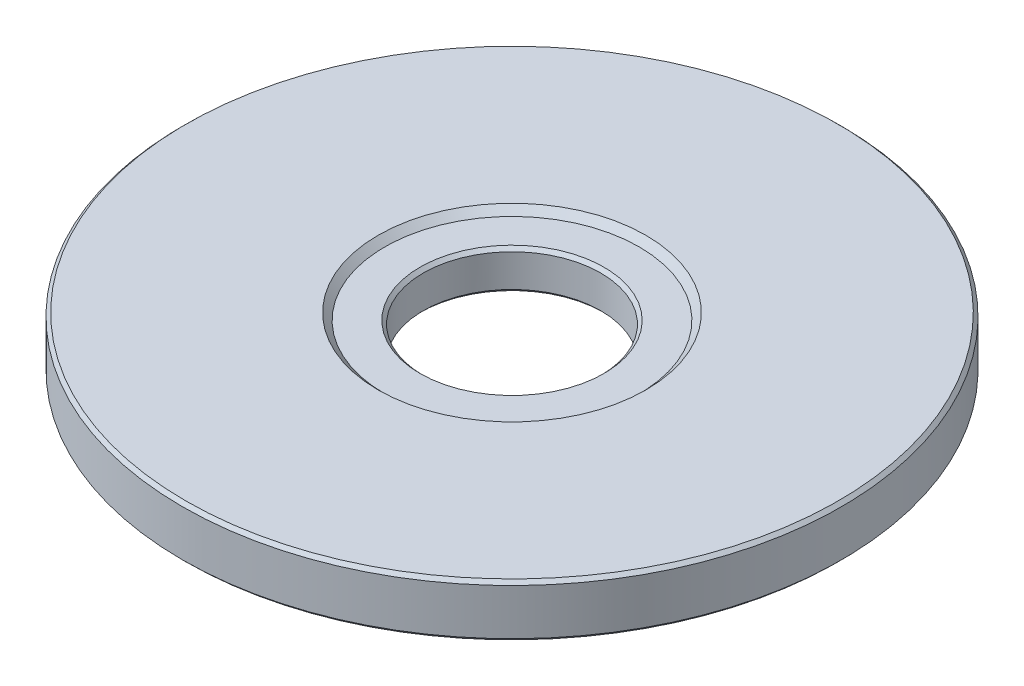
ISO-10303-21;
HEADER;
FILE_DESCRIPTION(('STEP AP214'),'2;1');
FILE_NAME('part.step','',(''),(''),'','','');
FILE_SCHEMA(('AUTOMOTIVE_DESIGN { 1 0 10303 214 1 1 1 1 }'));
ENDSEC;
DATA;
#1=APPLICATION_CONTEXT('core data for automotive mechanical design processes');
#2=APPLICATION_PROTOCOL_DEFINITION('international standard','automotive_design',2000,#1);
#3=PRODUCT_CONTEXT('',#1,'mechanical');
#4=PRODUCT('Part','Part','',(#3));
#5=PRODUCT_RELATED_PRODUCT_CATEGORY('part','',(#4));
#6=PRODUCT_DEFINITION_FORMATION('','',#4);
#7=PRODUCT_DEFINITION_CONTEXT('part definition',#1,'design');
#8=PRODUCT_DEFINITION('design','',#6,#7);
#9=PRODUCT_DEFINITION_SHAPE('','',#8);
#10=(LENGTH_UNIT() NAMED_UNIT(*) SI_UNIT(.MILLI.,.METRE.));
#11=(NAMED_UNIT(*) PLANE_ANGLE_UNIT() SI_UNIT($,.RADIAN.));
#12=(NAMED_UNIT(*) SI_UNIT($,.STERADIAN.) SOLID_ANGLE_UNIT());
#13=UNCERTAINTY_MEASURE_WITH_UNIT(LENGTH_MEASURE(1.E-05),#10,'distance_accuracy_value','');
#14=(GEOMETRIC_REPRESENTATION_CONTEXT(3) GLOBAL_UNCERTAINTY_ASSIGNED_CONTEXT((#13)) GLOBAL_UNIT_ASSIGNED_CONTEXT((#10,
#11,#12)) REPRESENTATION_CONTEXT('',''));
#15=CARTESIAN_POINT('',(0.,0.,0.));
#16=DIRECTION('',(0.,0.,1.));
#17=DIRECTION('',(1.,0.,0.));
#18=AXIS2_PLACEMENT_3D('',#15,#16,#17);
#19=CARTESIAN_POINT('',(-5.17927347777913,41.3814507964171,-24.7015296694144));
#20=DIRECTION('',(0.,-1.,0.));
#21=DIRECTION('',(0.,0.,-1.));
#22=AXIS2_PLACEMENT_3D('',#19,#20,#21);
#23=CYLINDRICAL_SURFACE('',#22,12.5);
#24=CARTESIAN_POINT('',(-5.17927347777913,39.5084507964171,-24.7015296694144));
#25=DIRECTION('',(0.,1.,0.));
#26=DIRECTION('',(0.,0.,1.));
#27=AXIS2_PLACEMENT_3D('',#24,#25,#26);
#28=CIRCLE('',#27,12.5);
#29=CARTESIAN_POINT('',(-5.17927347777913,39.5084507964171,-12.2015296694144));
#30=VERTEX_POINT('',#29);
#31=EDGE_CURVE('E29',#30,#30,#28,.T.);
#32=ORIENTED_EDGE('',*,*,#31,.T.);
#33=EDGE_LOOP('',(#32));
#34=FACE_BOUND('',#33,.T.);
#35=CARTESIAN_POINT('',(-5.17927347777913,41.2544507964171,-24.7015296694144));
#36=DIRECTION('',(0.,1.,0.));
#37=DIRECTION('',(0.,0.,1.));
#38=AXIS2_PLACEMENT_3D('',#35,#36,#37);
#39=CIRCLE('',#38,12.5);
#40=CARTESIAN_POINT('',(-5.17927347777913,41.2544507964171,-12.2015296694144));
#41=VERTEX_POINT('',#40);
#42=EDGE_CURVE('E35',#41,#41,#39,.F.);
#43=ORIENTED_EDGE('',*,*,#42,.T.);
#44=EDGE_LOOP('',(#43));
#45=FACE_BOUND('',#44,.T.);
#46=ADVANCED_FACE('F14',(#34,#45),#23,.T.);
#47=CARTESIAN_POINT('',(-5.17927347777913,41.3814507964171,-24.7015296694144));
#48=DIRECTION('',(0.,1.,0.));
#49=DIRECTION('',(0.,0.,1.));
#50=AXIS2_PLACEMENT_3D('',#47,#48,#49);
#51=PLANE('',#50);
#52=CARTESIAN_POINT('',(-5.17927347777913,41.3814507964171,-24.7015296694144));
#53=DIRECTION('',(0.,1.,0.));
#54=DIRECTION('',(0.,0.,1.));
#55=AXIS2_PLACEMENT_3D('',#52,#53,#54);
#56=CIRCLE('',#55,12.373);
#57=CARTESIAN_POINT('',(-5.17927347777913,41.3814507964171,-12.3285296694144));
#58=VERTEX_POINT('',#57);
#59=EDGE_CURVE('E10',#58,#58,#56,.T.);
#60=ORIENTED_EDGE('',*,*,#59,.T.);
#61=EDGE_LOOP('',(#60));
#62=FACE_BOUND('',#61,.T.);
#63=CARTESIAN_POINT('',(-5.17927347777913,41.3814507964171,-24.7015296694144));
#64=DIRECTION('',(0.,1.,0.));
#65=DIRECTION('',(0.,0.,1.));
#66=AXIS2_PLACEMENT_3D('',#63,#64,#65);
#67=CIRCLE('',#66,5.08);
#68=CARTESIAN_POINT('',(-5.17927347777913,41.3814507964171,-19.6215296694144));
#69=VERTEX_POINT('',#68);
#70=EDGE_CURVE('E69',#69,#69,#67,.T.);
#71=ORIENTED_EDGE('',*,*,#70,.F.);
#72=EDGE_LOOP('',(#71));
#73=FACE_BOUND('',#72,.T.);
#74=ADVANCED_FACE('F78',(#62,#73),#51,.T.);
#75=CARTESIAN_POINT('',(-5.17927347777913,39.3814507964171,-24.7015296694144));
#76=DIRECTION('',(0.,1.,0.));
#77=DIRECTION('',(0.,0.,1.));
#78=AXIS2_PLACEMENT_3D('',#75,#76,#77);
#79=PLANE('',#78);
#80=CARTESIAN_POINT('',(-5.17927347777913,39.3814507964171,-24.7015296694144));
#81=DIRECTION('',(0.,1.,0.));
#82=DIRECTION('',(0.,0.,1.));
#83=AXIS2_PLACEMENT_3D('',#80,#81,#82);
#84=CIRCLE('',#83,12.373);
#85=CARTESIAN_POINT('',(-5.17927347777913,39.3814507964171,-12.3285296694144));
#86=VERTEX_POINT('',#85);
#87=EDGE_CURVE('E22',#86,#86,#84,.F.);
#88=ORIENTED_EDGE('',*,*,#87,.T.);
#89=EDGE_LOOP('',(#88));
#90=FACE_BOUND('',#89,.T.);
#91=CARTESIAN_POINT('',(-5.17927347777913,39.3814507964171,-24.7015296694144));
#92=DIRECTION('',(0.,-1.,0.));
#93=DIRECTION('',(0.,0.,-1.));
#94=AXIS2_PLACEMENT_3D('',#91,#92,#93);
#95=CIRCLE('',#94,5.08);
#96=CARTESIAN_POINT('',(-5.17927347777913,39.3814507964171,-29.7815296694144));
#97=VERTEX_POINT('',#96);
#98=EDGE_CURVE('E65',#97,#97,#95,.T.);
#99=ORIENTED_EDGE('',*,*,#98,.F.);
#100=EDGE_LOOP('',(#99));
#101=FACE_BOUND('',#100,.T.);
#102=ADVANCED_FACE('F80',(#90,#101),#79,.F.);
#103=CARTESIAN_POINT('',(-5.17927347777913,39.6354507964171,-24.7015296694144));
#104=DIRECTION('',(0.,-1.,0.));
#105=DIRECTION('',(0.,0.,-1.));
#106=AXIS2_PLACEMENT_3D('',#103,#104,#105);
#107=PLANE('',#106);
#108=CARTESIAN_POINT('',(-5.17927347777913,39.6354507964171,-24.7015296694144));
#109=DIRECTION('',(0.,-1.,0.));
#110=DIRECTION('',(0.,0.,-1.));
#111=AXIS2_PLACEMENT_3D('',#108,#109,#110);
#112=CIRCLE('',#111,3.49250000000001);
#113=CARTESIAN_POINT('',(-5.17927347777913,39.6354507964171,-28.1940296694144));
#114=VERTEX_POINT('',#113);
#115=EDGE_CURVE('E41',#114,#114,#112,.F.);
#116=ORIENTED_EDGE('',*,*,#115,.T.);
#117=EDGE_LOOP('',(#116));
#118=FACE_BOUND('',#117,.T.);
#119=CARTESIAN_POINT('',(-5.17927347777913,39.6354507964171,-24.7015296694144));
#120=DIRECTION('',(0.,-1.,0.));
#121=DIRECTION('',(0.,0.,-1.));
#122=AXIS2_PLACEMENT_3D('',#119,#120,#121);
#123=CIRCLE('',#122,4.826);
#124=CARTESIAN_POINT('',(-5.17927347777913,39.6354507964171,-29.5275296694144));
#125=VERTEX_POINT('',#124);
#126=EDGE_CURVE('E57',#125,#125,#123,.T.);
#127=ORIENTED_EDGE('',*,*,#126,.T.);
#128=EDGE_LOOP('',(#127));
#129=FACE_BOUND('',#128,.T.);
#130=ADVANCED_FACE('F87',(#118,#129),#107,.T.);
#131=CARTESIAN_POINT('',(-5.17927347777913,41.1274507964171,-24.7015296694144));
#132=DIRECTION('',(0.,1.,0.));
#133=DIRECTION('',(0.,0.,1.));
#134=AXIS2_PLACEMENT_3D('',#131,#132,#133);
#135=PLANE('',#134);
#136=CARTESIAN_POINT('',(-5.17927347777913,41.1274507964171,-24.7015296694144));
#137=DIRECTION('',(0.,1.,0.));
#138=DIRECTION('',(0.,0.,1.));
#139=AXIS2_PLACEMENT_3D('',#136,#137,#138);
#140=CIRCLE('',#139,3.49250000000002);
#141=CARTESIAN_POINT('',(-5.17927347777913,41.1274507964171,-21.2090296694144));
#142=VERTEX_POINT('',#141);
#143=EDGE_CURVE('E45',#142,#142,#140,.F.);
#144=ORIENTED_EDGE('',*,*,#143,.T.);
#145=EDGE_LOOP('',(#144));
#146=FACE_BOUND('',#145,.T.);
#147=CARTESIAN_POINT('',(-5.17927347777913,41.1274507964171,-24.7015296694144));
#148=DIRECTION('',(0.,1.,0.));
#149=DIRECTION('',(0.,0.,1.));
#150=AXIS2_PLACEMENT_3D('',#147,#148,#149);
#151=CIRCLE('',#150,4.826);
#152=CARTESIAN_POINT('',(-5.17927347777913,41.1274507964171,-19.8755296694144));
#153=VERTEX_POINT('',#152);
#154=EDGE_CURVE('E61',#153,#153,#151,.T.);
#155=ORIENTED_EDGE('',*,*,#154,.T.);
#156=EDGE_LOOP('',(#155));
#157=FACE_BOUND('',#156,.T.);
#158=ADVANCED_FACE('F97',(#146,#157),#135,.T.);
#159=CARTESIAN_POINT('',(-5.17927347777913,41.1274507964171,-24.7015296694144));
#160=DIRECTION('',(0.,1.,0.));
#161=DIRECTION('',(0.,0.,1.));
#162=AXIS2_PLACEMENT_3D('',#159,#160,#161);
#163=CONICAL_SURFACE('',#162,4.826,0.785398163397457);
#164=ORIENTED_EDGE('',*,*,#70,.T.);
#165=EDGE_LOOP('',(#164));
#166=FACE_BOUND('',#165,.T.);
#167=ORIENTED_EDGE('',*,*,#154,.F.);
#168=EDGE_LOOP('',(#167));
#169=FACE_BOUND('',#168,.T.);
#170=ADVANCED_FACE('F75',(#166,#169),#163,.F.);
#171=CARTESIAN_POINT('',(-5.17927347777913,39.6354507964171,-24.7015296694144));
#172=DIRECTION('',(0.,-1.,0.));
#173=DIRECTION('',(0.,0.,-1.));
#174=AXIS2_PLACEMENT_3D('',#171,#172,#173);
#175=CONICAL_SURFACE('',#174,4.826,0.785398163397457);
#176=ORIENTED_EDGE('',*,*,#98,.T.);
#177=EDGE_LOOP('',(#176));
#178=FACE_BOUND('',#177,.T.);
#179=ORIENTED_EDGE('',*,*,#126,.F.);
#180=EDGE_LOOP('',(#179));
#181=FACE_BOUND('',#180,.T.);
#182=ADVANCED_FACE('F96',(#178,#181),#175,.F.);
#183=CARTESIAN_POINT('',(-5.17927347777913,41.3814507964171,-24.7015296694144));
#184=DIRECTION('',(0.,-1.,0.));
#185=DIRECTION('',(0.,0.,-1.));
#186=AXIS2_PLACEMENT_3D('',#183,#184,#185);
#187=CYLINDRICAL_SURFACE('',#186,3.3655);
#188=CARTESIAN_POINT('',(-5.17927347777913,41.0004507964171,-24.7015296694144));
#189=DIRECTION('',(0.,1.,0.));
#190=DIRECTION('',(0.,0.,1.));
#191=AXIS2_PLACEMENT_3D('',#188,#189,#190);
#192=CIRCLE('',#191,3.3655);
#193=CARTESIAN_POINT('',(-5.17927347777913,41.0004507964171,-28.0670296694144));
#194=VERTEX_POINT('',#193);
#195=EDGE_CURVE('E49',#194,#194,#192,.T.);
#196=CARTESIAN_POINT('',(-5.17927347777913,39.7624507964171,-24.7015296694144));
#197=DIRECTION('',(0.,-1.,0.));
#198=DIRECTION('',(0.,0.,-1.));
#199=AXIS2_PLACEMENT_3D('',#196,#197,#198);
#200=CIRCLE('',#199,3.3655);
#201=CARTESIAN_POINT('',(-5.17927347777913,39.7624507964171,-28.0670296694144));
#202=VERTEX_POINT('',#201);
#203=EDGE_CURVE('E53',#202,#202,#200,.T.);
#204=CARTESIAN_POINT('',(-5.17927347777913,41.0004507964171,-28.0670296694144));
#205=CARTESIAN_POINT('',(-5.17927347777913,40.9875549630837,-28.0670296694144));
#206=CARTESIAN_POINT('',(-5.17927347777913,40.9746591297504,-28.0670296694144));
#207=CARTESIAN_POINT('',(-5.17927347777913,40.9488674630837,-28.0670296694144));
#208=CARTESIAN_POINT('',(-5.17927347777913,40.9359716297504,-28.0670296694144));
#209=CARTESIAN_POINT('',(-5.17927347777913,40.9101799630837,-28.0670296694144));
#210=CARTESIAN_POINT('',(-5.17927347777913,40.8972841297504,-28.0670296694144));
#211=CARTESIAN_POINT('',(-5.17927347777913,40.8714924630837,-28.0670296694144));
#212=CARTESIAN_POINT('',(-5.17927347777913,40.8585966297504,-28.0670296694144));
#213=CARTESIAN_POINT('',(-5.17927347777913,40.8328049630837,-28.0670296694144));
#214=CARTESIAN_POINT('',(-5.17927347777913,40.8199091297504,-28.0670296694144));
#215=CARTESIAN_POINT('',(-5.17927347777913,40.7941174630837,-28.0670296694144));
#216=CARTESIAN_POINT('',(-5.17927347777913,40.7812216297504,-28.0670296694144));
#217=CARTESIAN_POINT('',(-5.17927347777913,40.7554299630837,-28.0670296694144));
#218=CARTESIAN_POINT('',(-5.17927347777913,40.7425341297504,-28.0670296694144));
#219=CARTESIAN_POINT('',(-5.17927347777913,40.7167424630837,-28.0670296694144));
#220=CARTESIAN_POINT('',(-5.17927347777913,40.7038466297504,-28.0670296694144));
#221=CARTESIAN_POINT('',(-5.17927347777913,40.6780549630837,-28.0670296694144));
#222=CARTESIAN_POINT('',(-5.17927347777913,40.6651591297504,-28.0670296694144));
#223=CARTESIAN_POINT('',(-5.17927347777913,40.6393674630837,-28.0670296694144));
#224=CARTESIAN_POINT('',(-5.17927347777913,40.6264716297504,-28.0670296694144));
#225=CARTESIAN_POINT('',(-5.17927347777913,40.6006799630837,-28.0670296694144));
#226=CARTESIAN_POINT('',(-5.17927347777913,40.5877841297504,-28.0670296694144));
#227=CARTESIAN_POINT('',(-5.17927347777913,40.5619924630837,-28.0670296694144));
#228=CARTESIAN_POINT('',(-5.17927347777913,40.5490966297504,-28.0670296694144));
#229=CARTESIAN_POINT('',(-5.17927347777913,40.5233049630837,-28.0670296694144));
#230=CARTESIAN_POINT('',(-5.17927347777913,40.5104091297504,-28.0670296694144));
#231=CARTESIAN_POINT('',(-5.17927347777913,40.4846174630837,-28.0670296694144));
#232=CARTESIAN_POINT('',(-5.17927347777913,40.4717216297504,-28.0670296694144));
#233=CARTESIAN_POINT('',(-5.17927347777913,40.4459299630837,-28.0670296694144));
#234=CARTESIAN_POINT('',(-5.17927347777913,40.4330341297504,-28.0670296694144));
#235=CARTESIAN_POINT('',(-5.17927347777913,40.4072424630837,-28.0670296694144));
#236=CARTESIAN_POINT('',(-5.17927347777913,40.3943466297504,-28.0670296694144));
#237=CARTESIAN_POINT('',(-5.17927347777913,40.3685549630837,-28.0670296694144));
#238=CARTESIAN_POINT('',(-5.17927347777913,40.3556591297504,-28.0670296694144));
#239=CARTESIAN_POINT('',(-5.17927347777913,40.3298674630838,-28.0670296694144));
#240=CARTESIAN_POINT('',(-5.17927347777913,40.3169716297504,-28.0670296694144));
#241=CARTESIAN_POINT('',(-5.17927347777913,40.2911799630837,-28.0670296694144));
#242=CARTESIAN_POINT('',(-5.17927347777913,40.2782841297504,-28.0670296694144));
#243=CARTESIAN_POINT('',(-5.17927347777913,40.2524924630838,-28.0670296694144));
#244=CARTESIAN_POINT('',(-5.17927347777913,40.2395966297504,-28.0670296694144));
#245=CARTESIAN_POINT('',(-5.17927347777913,40.2138049630838,-28.0670296694144));
#246=CARTESIAN_POINT('',(-5.17927347777913,40.2009091297504,-28.0670296694144));
#247=CARTESIAN_POINT('',(-5.17927347777913,40.1751174630838,-28.0670296694144));
#248=CARTESIAN_POINT('',(-5.17927347777913,40.1622216297504,-28.0670296694144));
#249=CARTESIAN_POINT('',(-5.17927347777913,40.1364299630838,-28.0670296694144));
#250=CARTESIAN_POINT('',(-5.17927347777913,40.1235341297504,-28.0670296694144));
#251=CARTESIAN_POINT('',(-5.17927347777913,40.0977424630838,-28.0670296694144));
#252=CARTESIAN_POINT('',(-5.17927347777913,40.0848466297504,-28.0670296694144));
#253=CARTESIAN_POINT('',(-5.17927347777913,40.0590549630838,-28.0670296694144));
#254=CARTESIAN_POINT('',(-5.17927347777913,40.0461591297504,-28.0670296694144));
#255=CARTESIAN_POINT('',(-5.17927347777913,40.0203674630838,-28.0670296694144));
#256=CARTESIAN_POINT('',(-5.17927347777913,40.0074716297504,-28.0670296694144));
#257=CARTESIAN_POINT('',(-5.17927347777913,39.9816799630838,-28.0670296694144));
#258=CARTESIAN_POINT('',(-5.17927347777913,39.9687841297504,-28.0670296694144));
#259=CARTESIAN_POINT('',(-5.17927347777913,39.9429924630838,-28.0670296694144));
#260=CARTESIAN_POINT('',(-5.17927347777913,39.9300966297504,-28.0670296694144));
#261=CARTESIAN_POINT('',(-5.17927347777913,39.9043049630838,-28.0670296694144));
#262=CARTESIAN_POINT('',(-5.17927347777913,39.8914091297504,-28.0670296694144));
#263=CARTESIAN_POINT('',(-5.17927347777913,39.8656174630838,-28.0670296694144));
#264=CARTESIAN_POINT('',(-5.17927347777913,39.8527216297504,-28.0670296694144));
#265=CARTESIAN_POINT('',(-5.17927347777913,39.8269299630838,-28.0670296694144));
#266=CARTESIAN_POINT('',(-5.17927347777913,39.8140341297504,-28.0670296694144));
#267=CARTESIAN_POINT('',(-5.17927347777913,39.7882424630838,-28.0670296694144));
#268=CARTESIAN_POINT('',(-5.17927347777913,39.7753466297504,-28.0670296694144));
#269=CARTESIAN_POINT('',(-5.17927347777913,39.7624507964171,-28.0670296694144));
#270=B_SPLINE_CURVE_WITH_KNOTS('',3,(#204,#205,#206,#207,#208,#209,#210,#211,#212,#213,#214,
#215,#216,#217,#218,#219,#220,#221,#222,#223,#224,#225,#226,#227,#228,#229,#230,#231,#232,#233,
#234,#235,#236,#237,#238,#239,#240,#241,#242,#243,#244,#245,#246,#247,#248,#249,#250,#251,#252,
#253,#254,#255,#256,#257,#258,#259,#260,#261,#262,#263,#264,#265,#266,#267,#268,#269),
.UNSPECIFIED.,.F.,.F.,(4,2,2,2,2,2,2,2,2,2,2,2,2,2,2,2,2,2,2,2,2,2,2,2,2,2,2,2,2,2,2,2,4),(0.,
0.0386874999999953,0.0773749999999976,0.116062499999993,0.154749999999995,0.19343749999999,
0.232124999999993,0.270812499999988,0.30949999999999,0.348187499999986,0.386874999999988,
0.425562499999983,0.464249999999986,0.502937499999981,0.541624999999983,0.580312499999978,
0.618999999999981,0.657687499999976,0.696374999999978,0.735062499999974,0.773749999999976,
0.812437499999971,0.851124999999973,0.889812499999969,0.928499999999971,0.967187499999966,
1.00587499999997,1.04456249999996,1.08324999999997,1.12193749999996,1.16062499999996,
1.19931249999996,1.23799999999996),.UNSPECIFIED.);
#271=EDGE_CURVE('BSEAM100',#194,#202,#270,.T.);
#272=ORIENTED_EDGE('',*,*,#195,.T.);
#273=ORIENTED_EDGE('',*,*,#203,.T.);
#274=ORIENTED_EDGE('',*,*,#271,.T.);
#275=ORIENTED_EDGE('',*,*,#271,.F.);
#276=EDGE_LOOP('',(#272,#274,#273,#275));
#277=FACE_BOUND('',#276,.T.);
#278=ADVANCED_FACE('F100',(#277),#187,.F.);
#279=CARTESIAN_POINT('',(-5.17927347777913,41.0004507964171,-24.7015296694144));
#280=DIRECTION('',(0.,1.,0.));
#281=DIRECTION('',(0.,0.,1.));
#282=AXIS2_PLACEMENT_3D('',#279,#280,#281);
#283=CONICAL_SURFACE('',#282,3.3655,0.785398163397448);
#284=ORIENTED_EDGE('',*,*,#143,.F.);
#285=EDGE_LOOP('',(#284));
#286=FACE_BOUND('',#285,.T.);
#287=ORIENTED_EDGE('',*,*,#195,.F.);
#288=EDGE_LOOP('',(#287));
#289=FACE_BOUND('',#288,.T.);
#290=ADVANCED_FACE('F102',(#286,#289),#283,.F.);
#291=CARTESIAN_POINT('',(-5.17927347777913,39.7624507964171,-24.7015296694144));
#292=DIRECTION('',(0.,-1.,0.));
#293=DIRECTION('',(0.,0.,-1.));
#294=AXIS2_PLACEMENT_3D('',#291,#292,#293);
#295=CONICAL_SURFACE('',#294,3.3655,0.785398163397438);
#296=ORIENTED_EDGE('',*,*,#115,.F.);
#297=EDGE_LOOP('',(#296));
#298=FACE_BOUND('',#297,.T.);
#299=ORIENTED_EDGE('',*,*,#203,.F.);
#300=EDGE_LOOP('',(#299));
#301=FACE_BOUND('',#300,.T.);
#302=ADVANCED_FACE('F105',(#298,#301),#295,.F.);
#303=CARTESIAN_POINT('',(-5.17927347777913,39.5084507964171,-24.7015296694144));
#304=DIRECTION('',(0.,1.,0.));
#305=DIRECTION('',(0.,0.,1.));
#306=AXIS2_PLACEMENT_3D('',#303,#304,#305);
#307=CONICAL_SURFACE('',#306,12.5,0.785398163397455);
#308=ORIENTED_EDGE('',*,*,#87,.F.);
#309=EDGE_LOOP('',(#308));
#310=FACE_BOUND('',#309,.T.);
#311=ORIENTED_EDGE('',*,*,#31,.F.);
#312=EDGE_LOOP('',(#311));
#313=FACE_BOUND('',#312,.T.);
#314=ADVANCED_FACE('F108',(#310,#313),#307,.T.);
#315=CARTESIAN_POINT('',(-5.17927347777913,41.3814507964171,-24.7015296694144));
#316=DIRECTION('',(0.,-1.,0.));
#317=DIRECTION('',(0.,0.,-1.));
#318=AXIS2_PLACEMENT_3D('',#315,#316,#317);
#319=CONICAL_SURFACE('',#318,12.373,0.785398163397469);
#320=ORIENTED_EDGE('',*,*,#42,.F.);
#321=EDGE_LOOP('',(#320));
#322=FACE_BOUND('',#321,.T.);
#323=ORIENTED_EDGE('',*,*,#59,.F.);
#324=EDGE_LOOP('',(#323));
#325=FACE_BOUND('',#324,.T.);
#326=ADVANCED_FACE('F16',(#322,#325),#319,.T.);
#327=CLOSED_SHELL('',(#46,#74,#102,#130,#158,#170,#182,#278,#290,#302,#314,#326));
#328=MANIFOLD_SOLID_BREP('B1',#327);
#329=ADVANCED_BREP_SHAPE_REPRESENTATION('',(#18,#328),#14);
#330=SHAPE_DEFINITION_REPRESENTATION(#9,#329);
ENDSEC;
END-ISO-10303-21;
